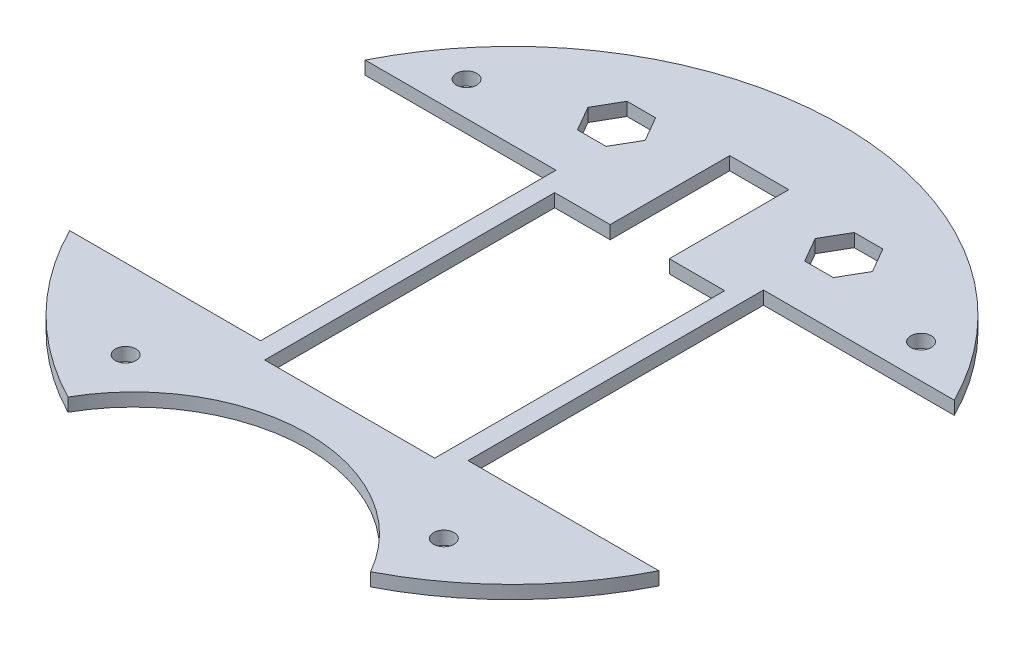
ISO-10303-21;
HEADER;
FILE_DESCRIPTION(('STEP AP214'),'2;1');
FILE_NAME('part.step','',(''),(''),'','','');
FILE_SCHEMA(('AUTOMOTIVE_DESIGN { 1 0 10303 214 1 1 1 1 }'));
ENDSEC;
DATA;
#1=APPLICATION_CONTEXT('core data for automotive mechanical design processes');
#2=APPLICATION_PROTOCOL_DEFINITION('international standard','automotive_design',2000,#1);
#3=PRODUCT_CONTEXT('',#1,'mechanical');
#4=PRODUCT('Part','Part','',(#3));
#5=PRODUCT_RELATED_PRODUCT_CATEGORY('part','',(#4));
#6=PRODUCT_DEFINITION_FORMATION('','',#4);
#7=PRODUCT_DEFINITION_CONTEXT('part definition',#1,'design');
#8=PRODUCT_DEFINITION('design','',#6,#7);
#9=PRODUCT_DEFINITION_SHAPE('','',#8);
#10=(LENGTH_UNIT() NAMED_UNIT(*) SI_UNIT(.MILLI.,.METRE.));
#11=(NAMED_UNIT(*) PLANE_ANGLE_UNIT() SI_UNIT($,.RADIAN.));
#12=(NAMED_UNIT(*) SI_UNIT($,.STERADIAN.) SOLID_ANGLE_UNIT());
#13=UNCERTAINTY_MEASURE_WITH_UNIT(LENGTH_MEASURE(1.E-05),#10,'distance_accuracy_value','');
#14=(GEOMETRIC_REPRESENTATION_CONTEXT(3) GLOBAL_UNCERTAINTY_ASSIGNED_CONTEXT((#13)) GLOBAL_UNIT_ASSIGNED_CONTEXT((#10,
#11,#12)) REPRESENTATION_CONTEXT('',''));
#15=CARTESIAN_POINT('',(0.,0.,0.));
#16=DIRECTION('',(0.,0.,1.));
#17=DIRECTION('',(1.,0.,0.));
#18=AXIS2_PLACEMENT_3D('',#15,#16,#17);
#19=CARTESIAN_POINT('',(18.7,0.,-28.1));
#20=DIRECTION('',(0.,0.,-1.));
#21=DIRECTION('',(-1.,0.,0.));
#22=AXIS2_PLACEMENT_3D('',#19,#20,#21);
#23=PLANE('',#22);
#24=DIRECTION('',(-1.,0.,0.));
#25=VECTOR('',#24,1.);
#26=CARTESIAN_POINT('',(18.7,0.,-28.1));
#27=LINE('',#26,#25);
#28=CARTESIAN_POINT('',(-6.5,0.,-28.1));
#29=VERTEX_POINT('',#28);
#30=CARTESIAN_POINT('',(-18.7,0.,-28.1));
#31=VERTEX_POINT('',#30);
#32=EDGE_CURVE('E424',#29,#31,#27,.T.);
#33=ORIENTED_EDGE('',*,*,#32,.F.);
#34=DIRECTION('',(0.,1.,0.));
#35=VECTOR('',#34,1.);
#36=CARTESIAN_POINT('',(-6.5,0.,-28.1));
#37=LINE('',#36,#35);
#38=CARTESIAN_POINT('',(-6.5,2.9,-28.1));
#39=VERTEX_POINT('',#38);
#40=EDGE_CURVE('E345',#29,#39,#37,.T.);
#41=ORIENTED_EDGE('',*,*,#40,.T.);
#42=DIRECTION('',(-1.,0.,0.));
#43=VECTOR('',#42,1.);
#44=CARTESIAN_POINT('',(18.7,2.9,-28.1));
#45=LINE('',#44,#43);
#46=CARTESIAN_POINT('',(-18.7,2.9,-28.1));
#47=VERTEX_POINT('',#46);
#48=EDGE_CURVE('E436',#39,#47,#45,.T.);
#49=ORIENTED_EDGE('',*,*,#48,.T.);
#50=DIRECTION('',(0.,1.,0.));
#51=VECTOR('',#50,1.);
#52=CARTESIAN_POINT('',(-18.7,0.,-28.1));
#53=LINE('',#52,#51);
#54=EDGE_CURVE('E439',#31,#47,#53,.T.);
#55=ORIENTED_EDGE('',*,*,#54,.F.);
#56=EDGE_LOOP('',(#33,#41,#49,#55));
#57=FACE_BOUND('',#56,.T.);
#58=ADVANCED_FACE('F33',(#57),#23,.F.);
#59=CARTESIAN_POINT('',(0.,2.9,0.));
#60=DIRECTION('',(0.,-1.,0.));
#61=DIRECTION('',(0.,0.,-1.));
#62=AXIS2_PLACEMENT_3D('',#59,#60,#61);
#63=CYLINDRICAL_SURFACE('',#62,72.5);
#64=CARTESIAN_POINT('',(0.,0.,0.));
#65=DIRECTION('',(0.,1.,0.));
#66=DIRECTION('',(0.,0.,1.));
#67=AXIS2_PLACEMENT_3D('',#64,#65,#66);
#68=CIRCLE('',#67,72.5);
#69=CARTESIAN_POINT('',(33.2911053697012,0.,64.4045984636458));
#70=VERTEX_POINT('',#69);
#71=CARTESIAN_POINT('',(64.8074069840786,0.,32.4999999999999));
#72=VERTEX_POINT('',#71);
#73=EDGE_CURVE('E453',#70,#72,#68,.T.);
#74=ORIENTED_EDGE('',*,*,#73,.T.);
#75=DIRECTION('',(0.,1.,0.));
#76=VECTOR('',#75,1.);
#77=CARTESIAN_POINT('',(64.8074069840786,0.,32.4999999999999));
#78=LINE('',#77,#76);
#79=CARTESIAN_POINT('',(64.8074069840786,2.9,32.4999999999999));
#80=VERTEX_POINT('',#79);
#81=EDGE_CURVE('E378',#72,#80,#78,.T.);
#82=ORIENTED_EDGE('',*,*,#81,.T.);
#83=CARTESIAN_POINT('',(0.,2.9,0.));
#84=DIRECTION('',(0.,1.,0.));
#85=DIRECTION('',(0.,0.,1.));
#86=AXIS2_PLACEMENT_3D('',#83,#84,#85);
#87=CIRCLE('',#86,72.5);
#88=CARTESIAN_POINT('',(33.2911053697012,2.9,64.4045984636458));
#89=VERTEX_POINT('',#88);
#90=EDGE_CURVE('E454',#89,#80,#87,.T.);
#91=ORIENTED_EDGE('',*,*,#90,.F.);
#92=DIRECTION('',(0.,-1.,0.));
#93=VECTOR('',#92,1.);
#94=CARTESIAN_POINT('',(33.2911053697012,2.9,64.4045984636458));
#95=LINE('',#94,#93);
#96=EDGE_CURVE('E11',#89,#70,#95,.T.);
#97=ORIENTED_EDGE('',*,*,#96,.T.);
#98=EDGE_LOOP('',(#74,#82,#91,#97));
#99=FACE_BOUND('',#98,.T.);
#100=ADVANCED_FACE('F475',(#99),#63,.T.);
#101=CARTESIAN_POINT('',(64.8074069840786,2.9,-32.5));
#102=VERTEX_POINT('',#101);
#103=CARTESIAN_POINT('',(-64.8074069840786,2.9,-32.5));
#104=VERTEX_POINT('',#103);
#105=EDGE_CURVE('E457',#102,#104,#87,.T.);
#106=ORIENTED_EDGE('',*,*,#105,.F.);
#107=DIRECTION('',(0.,1.,0.));
#108=VECTOR('',#107,1.);
#109=CARTESIAN_POINT('',(64.8074069840786,0.,-32.5));
#110=LINE('',#109,#108);
#111=CARTESIAN_POINT('',(64.8074069840786,0.,-32.5));
#112=VERTEX_POINT('',#111);
#113=EDGE_CURVE('E371',#112,#102,#110,.T.);
#114=ORIENTED_EDGE('',*,*,#113,.F.);
#115=CARTESIAN_POINT('',(-64.8074069840786,0.,-32.5));
#116=VERTEX_POINT('',#115);
#117=EDGE_CURVE('E462',#112,#116,#68,.T.);
#118=ORIENTED_EDGE('',*,*,#117,.T.);
#119=DIRECTION('',(0.,1.,0.));
#120=VECTOR('',#119,1.);
#121=CARTESIAN_POINT('',(-64.8074069840786,0.,-32.5));
#122=LINE('',#121,#120);
#123=EDGE_CURVE('E408',#116,#104,#122,.T.);
#124=ORIENTED_EDGE('',*,*,#123,.T.);
#125=EDGE_LOOP('',(#106,#114,#118,#124));
#126=FACE_BOUND('',#125,.T.);
#127=ADVANCED_FACE('F492',(#126),#63,.T.);
#128=CARTESIAN_POINT('',(0.,2.9,83.2397996376034));
#129=DIRECTION('',(0.,-1.,0.));
#130=DIRECTION('',(0.,0.,-1.));
#131=AXIS2_PLACEMENT_3D('',#128,#129,#130);
#132=CYLINDRICAL_SURFACE('',#131,38.25);
#133=CARTESIAN_POINT('',(0.,0.,83.2397996376034));
#134=DIRECTION('',(0.,-1.,0.));
#135=DIRECTION('',(0.,0.,1.));
#136=AXIS2_PLACEMENT_3D('',#133,#134,#135);
#137=CIRCLE('',#136,38.25);
#138=CARTESIAN_POINT('',(-33.2911053697012,0.,64.4045984636458));
#139=VERTEX_POINT('',#138);
#140=EDGE_CURVE('E442',#139,#70,#137,.T.);
#141=ORIENTED_EDGE('',*,*,#140,.T.);
#142=ORIENTED_EDGE('',*,*,#96,.F.);
#143=CARTESIAN_POINT('',(0.,2.9,83.2397996376034));
#144=DIRECTION('',(0.,-1.,0.));
#145=DIRECTION('',(0.,0.,1.));
#146=AXIS2_PLACEMENT_3D('',#143,#144,#145);
#147=CIRCLE('',#146,38.25);
#148=CARTESIAN_POINT('',(-33.2911053697012,2.9,64.4045984636458));
#149=VERTEX_POINT('',#148);
#150=EDGE_CURVE('E449',#149,#89,#147,.T.);
#151=ORIENTED_EDGE('',*,*,#150,.F.);
#152=DIRECTION('',(0.,-1.,0.));
#153=VECTOR('',#152,1.);
#154=CARTESIAN_POINT('',(-33.2911053697012,2.9,64.4045984636458));
#155=LINE('',#154,#153);
#156=EDGE_CURVE('E41',#149,#139,#155,.T.);
#157=ORIENTED_EDGE('',*,*,#156,.T.);
#158=EDGE_LOOP('',(#141,#142,#151,#157));
#159=FACE_BOUND('',#158,.T.);
#160=ADVANCED_FACE('F35',(#159),#132,.F.);
#161=CARTESIAN_POINT('',(-64.8074069840787,2.9,32.4999999999999));
#162=VERTEX_POINT('',#161);
#163=EDGE_CURVE('E452',#162,#149,#87,.T.);
#164=ORIENTED_EDGE('',*,*,#163,.F.);
#165=DIRECTION('',(0.,1.,0.));
#166=VECTOR('',#165,1.);
#167=CARTESIAN_POINT('',(-64.8074069840787,0.,32.4999999999999));
#168=LINE('',#167,#166);
#169=CARTESIAN_POINT('',(-64.8074069840787,0.,32.4999999999999));
#170=VERTEX_POINT('',#169);
#171=EDGE_CURVE('E405',#170,#162,#168,.T.);
#172=ORIENTED_EDGE('',*,*,#171,.F.);
#173=EDGE_CURVE('E460',#170,#139,#68,.T.);
#174=ORIENTED_EDGE('',*,*,#173,.T.);
#175=ORIENTED_EDGE('',*,*,#156,.F.);
#176=EDGE_LOOP('',(#164,#172,#174,#175));
#177=FACE_BOUND('',#176,.T.);
#178=ADVANCED_FACE('F494',(#177),#63,.T.);
#179=CARTESIAN_POINT('',(0.,2.9,41.6198998188017));
#180=DIRECTION('',(0.,1.,0.));
#181=DIRECTION('',(0.,0.,1.));
#182=AXIS2_PLACEMENT_3D('',#179,#180,#181);
#183=PLANE('',#182);
#184=CARTESIAN_POINT('',(-35.,2.9,50.));
#185=DIRECTION('',(0.,1.,0.));
#186=DIRECTION('',(0.,0.,1.));
#187=AXIS2_PLACEMENT_3D('',#184,#185,#186);
#188=CIRCLE('',#187,2.25);
#189=CARTESIAN_POINT('',(-35.,2.9,52.25));
#190=VERTEX_POINT('',#189);
#191=EDGE_CURVE('E782',#190,#190,#188,.T.);
#192=ORIENTED_EDGE('',*,*,#191,.F.);
#193=EDGE_LOOP('',(#192));
#194=FACE_BOUND('',#193,.T.);
#195=CARTESIAN_POINT('',(-50.,2.9,-40.));
#196=DIRECTION('',(0.,1.,0.));
#197=DIRECTION('',(0.,0.,1.));
#198=AXIS2_PLACEMENT_3D('',#195,#196,#197);
#199=CIRCLE('',#198,2.25);
#200=CARTESIAN_POINT('',(-50.,2.9,-37.75));
#201=VERTEX_POINT('',#200);
#202=EDGE_CURVE('E787',#201,#201,#199,.T.);
#203=ORIENTED_EDGE('',*,*,#202,.F.);
#204=EDGE_LOOP('',(#203));
#205=FACE_BOUND('',#204,.T.);
#206=CARTESIAN_POINT('',(50.,2.9,-40.));
#207=DIRECTION('',(0.,1.,0.));
#208=DIRECTION('',(0.,0.,1.));
#209=AXIS2_PLACEMENT_3D('',#206,#207,#208);
#210=CIRCLE('',#209,2.25);
#211=CARTESIAN_POINT('',(50.,2.9,-37.75));
#212=VERTEX_POINT('',#211);
#213=EDGE_CURVE('E795',#212,#212,#210,.T.);
#214=ORIENTED_EDGE('',*,*,#213,.F.);
#215=EDGE_LOOP('',(#214));
#216=FACE_BOUND('',#215,.T.);
#217=CARTESIAN_POINT('',(35.,2.9,50.));
#218=DIRECTION('',(0.,1.,0.));
#219=DIRECTION('',(0.,0.,1.));
#220=AXIS2_PLACEMENT_3D('',#217,#218,#219);
#221=CIRCLE('',#220,2.25);
#222=CARTESIAN_POINT('',(35.,2.9,52.25));
#223=VERTEX_POINT('',#222);
#224=EDGE_CURVE('E255',#223,#223,#221,.T.);
#225=ORIENTED_EDGE('',*,*,#224,.F.);
#226=EDGE_LOOP('',(#225));
#227=FACE_BOUND('',#226,.T.);
#228=DIRECTION('',(1.,0.,0.));
#229=VECTOR('',#228,1.);
#230=CARTESIAN_POINT('',(28.1465589670835,2.9,-42.55));
#231=LINE('',#230,#229);
#232=CARTESIAN_POINT('',(21.8534410329166,2.9,-42.55));
#233=VERTEX_POINT('',#232);
#234=CARTESIAN_POINT('',(28.1465589670834,2.9,-42.55));
#235=VERTEX_POINT('',#234);
#236=EDGE_CURVE('E48',#233,#235,#231,.T.);
#237=ORIENTED_EDGE('',*,*,#236,.F.);
#238=DIRECTION('',(0.5,0.,0.866025403784439));
#239=VECTOR('',#238,1.);
#240=CARTESIAN_POINT('',(21.8534410329166,2.9,-42.55));
#241=LINE('',#240,#239);
#242=CARTESIAN_POINT('',(18.7068820658331,2.9,-48.));
#243=VERTEX_POINT('',#242);
#244=EDGE_CURVE('E249',#243,#233,#241,.T.);
#245=ORIENTED_EDGE('',*,*,#244,.F.);
#246=DIRECTION('',(-0.5,0.,0.866025403784438));
#247=VECTOR('',#246,1.);
#248=CARTESIAN_POINT('',(18.7068820658331,2.9,-48.));
#249=LINE('',#248,#247);
#250=CARTESIAN_POINT('',(21.8534410329165,2.9,-53.45));
#251=VERTEX_POINT('',#250);
#252=EDGE_CURVE('E252',#251,#243,#249,.T.);
#253=ORIENTED_EDGE('',*,*,#252,.F.);
#254=DIRECTION('',(-1.,0.,0.));
#255=VECTOR('',#254,1.);
#256=CARTESIAN_POINT('',(21.8534410329165,2.9,-53.45));
#257=LINE('',#256,#255);
#258=CARTESIAN_POINT('',(28.1465589670835,2.9,-53.45));
#259=VERTEX_POINT('',#258);
#260=EDGE_CURVE('E272',#259,#251,#257,.T.);
#261=ORIENTED_EDGE('',*,*,#260,.F.);
#262=DIRECTION('',(-0.5,0.,-0.866025403784439));
#263=VECTOR('',#262,1.);
#264=CARTESIAN_POINT('',(28.1465589670835,2.9,-53.45));
#265=LINE('',#264,#263);
#266=CARTESIAN_POINT('',(31.2931179341669,2.9,-48.));
#267=VERTEX_POINT('',#266);
#268=EDGE_CURVE('E269',#267,#259,#265,.T.);
#269=ORIENTED_EDGE('',*,*,#268,.F.);
#270=DIRECTION('',(0.499999999999999,0.,-0.866025403784439));
#271=VECTOR('',#270,1.);
#272=CARTESIAN_POINT('',(31.2931179341669,2.9,-48.));
#273=LINE('',#272,#271);
#274=EDGE_CURVE('E266',#235,#267,#273,.T.);
#275=ORIENTED_EDGE('',*,*,#274,.F.);
#276=EDGE_LOOP('',(#237,#245,#253,#261,#269,#275));
#277=FACE_BOUND('',#276,.T.);
#278=DIRECTION('',(0.5,0.,-0.866025403784439));
#279=VECTOR('',#278,1.);
#280=CARTESIAN_POINT('',(-21.8534410329166,2.9,-42.55));
#281=LINE('',#280,#279);
#282=CARTESIAN_POINT('',(-21.8534410329166,2.9,-42.55));
#283=VERTEX_POINT('',#282);
#284=CARTESIAN_POINT('',(-18.7068820658331,2.9,-48.));
#285=VERTEX_POINT('',#284);
#286=EDGE_CURVE('E279',#283,#285,#281,.T.);
#287=ORIENTED_EDGE('',*,*,#286,.F.);
#288=DIRECTION('',(1.,0.,0.));
#289=VECTOR('',#288,1.);
#290=CARTESIAN_POINT('',(-28.1465589670835,2.9,-42.55));
#291=LINE('',#290,#289);
#292=CARTESIAN_POINT('',(-28.1465589670835,2.9,-42.55));
#293=VERTEX_POINT('',#292);
#294=EDGE_CURVE('E291',#293,#283,#291,.T.);
#295=ORIENTED_EDGE('',*,*,#294,.F.);
#296=DIRECTION('',(0.499999999999999,0.,0.866025403784439));
#297=VECTOR('',#296,1.);
#298=CARTESIAN_POINT('',(-31.2931179341669,2.9,-48.));
#299=LINE('',#298,#297);
#300=CARTESIAN_POINT('',(-31.2931179341669,2.9,-48.));
#301=VERTEX_POINT('',#300);
#302=EDGE_CURVE('E317',#301,#293,#299,.T.);
#303=ORIENTED_EDGE('',*,*,#302,.F.);
#304=DIRECTION('',(-0.5,0.,0.866025403784439));
#305=VECTOR('',#304,1.);
#306=CARTESIAN_POINT('',(-28.1465589670835,2.9,-53.45));
#307=LINE('',#306,#305);
#308=CARTESIAN_POINT('',(-28.1465589670835,2.9,-53.45));
#309=VERTEX_POINT('',#308);
#310=EDGE_CURVE('E314',#309,#301,#307,.T.);
#311=ORIENTED_EDGE('',*,*,#310,.F.);
#312=DIRECTION('',(-1.,0.,0.));
#313=VECTOR('',#312,1.);
#314=CARTESIAN_POINT('',(-21.8534410329165,2.9,-53.45));
#315=LINE('',#314,#313);
#316=CARTESIAN_POINT('',(-21.8534410329165,2.9,-53.45));
#317=VERTEX_POINT('',#316);
#318=EDGE_CURVE('E311',#317,#309,#315,.T.);
#319=ORIENTED_EDGE('',*,*,#318,.F.);
#320=DIRECTION('',(-0.5,0.,-0.866025403784438));
#321=VECTOR('',#320,1.);
#322=CARTESIAN_POINT('',(-18.7068820658331,2.9,-48.));
#323=LINE('',#322,#321);
#324=EDGE_CURVE('E308',#285,#317,#323,.T.);
#325=ORIENTED_EDGE('',*,*,#324,.F.);
#326=EDGE_LOOP('',(#287,#295,#303,#311,#319,#325));
#327=FACE_BOUND('',#326,.T.);
#328=DIRECTION('',(0.,0.,1.));
#329=VECTOR('',#328,1.);
#330=CARTESIAN_POINT('',(-6.5,2.9,-28.1));
#331=LINE('',#330,#329);
#332=CARTESIAN_POINT('',(-6.5,2.9,-54.4));
#333=VERTEX_POINT('',#332);
#334=EDGE_CURVE('E324',#333,#39,#331,.T.);
#335=ORIENTED_EDGE('',*,*,#334,.F.);
#336=DIRECTION('',(-1.,0.,0.));
#337=VECTOR('',#336,1.);
#338=CARTESIAN_POINT('',(6.5,2.9,-54.4));
#339=LINE('',#338,#337);
#340=CARTESIAN_POINT('',(6.5,2.9,-54.4));
#341=VERTEX_POINT('',#340);
#342=EDGE_CURVE('E339',#341,#333,#339,.T.);
#343=ORIENTED_EDGE('',*,*,#342,.F.);
#344=DIRECTION('',(0.,0.,-1.));
#345=VECTOR('',#344,1.);
#346=CARTESIAN_POINT('',(6.5,2.9,-28.1));
#347=LINE('',#346,#345);
#348=CARTESIAN_POINT('',(6.5,2.9,-28.1));
#349=VERTEX_POINT('',#348);
#350=EDGE_CURVE('E347',#349,#341,#347,.T.);
#351=ORIENTED_EDGE('',*,*,#350,.F.);
#352=CARTESIAN_POINT('',(18.7,2.9,-28.1));
#353=VERTEX_POINT('',#352);
#354=EDGE_CURVE('E418',#353,#349,#45,.T.);
#355=ORIENTED_EDGE('',*,*,#354,.F.);
#356=DIRECTION('',(0.,0.,-1.));
#357=VECTOR('',#356,1.);
#358=CARTESIAN_POINT('',(18.7,2.9,35.7));
#359=LINE('',#358,#357);
#360=CARTESIAN_POINT('',(18.7,2.9,35.7));
#361=VERTEX_POINT('',#360);
#362=EDGE_CURVE('E433',#361,#353,#359,.T.);
#363=ORIENTED_EDGE('',*,*,#362,.F.);
#364=DIRECTION('',(1.,0.,0.));
#365=VECTOR('',#364,1.);
#366=CARTESIAN_POINT('',(-18.7,2.9,35.7));
#367=LINE('',#366,#365);
#368=CARTESIAN_POINT('',(-18.7,2.9,35.7));
#369=VERTEX_POINT('',#368);
#370=EDGE_CURVE('E430',#369,#361,#367,.T.);
#371=ORIENTED_EDGE('',*,*,#370,.F.);
#372=DIRECTION('',(0.,0.,1.));
#373=VECTOR('',#372,1.);
#374=CARTESIAN_POINT('',(-18.7,2.9,-28.1));
#375=LINE('',#374,#373);
#376=EDGE_CURVE('E407',#47,#369,#375,.T.);
#377=ORIENTED_EDGE('',*,*,#376,.F.);
#378=ORIENTED_EDGE('',*,*,#48,.F.);
#379=EDGE_LOOP('',(#335,#343,#351,#355,#363,#371,#377,#378));
#380=FACE_BOUND('',#379,.T.);
#381=DIRECTION('',(1.,0.,0.));
#382=VECTOR('',#381,1.);
#383=CARTESIAN_POINT('',(34.6299999999999,2.9,32.5));
#384=LINE('',#383,#382);
#385=CARTESIAN_POINT('',(22.8299999999999,2.9,32.4999999999999));
#386=VERTEX_POINT('',#385);
#387=EDGE_CURVE('E365',#386,#80,#384,.T.);
#388=ORIENTED_EDGE('',*,*,#387,.F.);
#389=DIRECTION('',(0.,0.,1.));
#390=VECTOR('',#389,1.);
#391=CARTESIAN_POINT('',(22.8299999999999,2.9,-32.5));
#392=LINE('',#391,#390);
#393=CARTESIAN_POINT('',(22.8299999999999,2.9,-32.5));
#394=VERTEX_POINT('',#393);
#395=EDGE_CURVE('E374',#394,#386,#392,.T.);
#396=ORIENTED_EDGE('',*,*,#395,.F.);
#397=DIRECTION('',(-1.,0.,0.));
#398=VECTOR('',#397,1.);
#399=CARTESIAN_POINT('',(64.8074069840786,2.9,-32.5));
#400=LINE('',#399,#398);
#401=EDGE_CURVE('E354',#102,#394,#400,.T.);
#402=ORIENTED_EDGE('',*,*,#401,.F.);
#403=ORIENTED_EDGE('',*,*,#105,.T.);
#404=DIRECTION('',(-1.,0.,0.));
#405=VECTOR('',#404,1.);
#406=CARTESIAN_POINT('',(-22.8299999999999,2.9,-32.5));
#407=LINE('',#406,#405);
#408=CARTESIAN_POINT('',(-22.8299999999999,2.9,-32.5));
#409=VERTEX_POINT('',#408);
#410=EDGE_CURVE('E391',#409,#104,#407,.T.);
#411=ORIENTED_EDGE('',*,*,#410,.F.);
#412=DIRECTION('',(0.,0.,-1.));
#413=VECTOR('',#412,1.);
#414=CARTESIAN_POINT('',(-22.8299999999999,2.9,32.4999999999999));
#415=LINE('',#414,#413);
#416=CARTESIAN_POINT('',(-22.8299999999999,2.9,32.4999999999999));
#417=VERTEX_POINT('',#416);
#418=EDGE_CURVE('E400',#417,#409,#415,.T.);
#419=ORIENTED_EDGE('',*,*,#418,.F.);
#420=DIRECTION('',(1.,0.,0.));
#421=VECTOR('',#420,1.);
#422=CARTESIAN_POINT('',(-34.6299999999999,2.9,32.5));
#423=LINE('',#422,#421);
#424=EDGE_CURVE('E381',#162,#417,#423,.T.);
#425=ORIENTED_EDGE('',*,*,#424,.F.);
#426=ORIENTED_EDGE('',*,*,#163,.T.);
#427=ORIENTED_EDGE('',*,*,#150,.T.);
#428=ORIENTED_EDGE('',*,*,#90,.T.);
#429=EDGE_LOOP('',(#388,#396,#402,#403,#411,#419,#425,#426,#427,#428));
#430=FACE_BOUND('',#429,.T.);
#431=ADVANCED_FACE('F478',(#194,#205,#216,#227,#277,#327,#380,#430),#183,.T.);
#432=CARTESIAN_POINT('',(0.,0.,41.6198998188017));
#433=DIRECTION('',(0.,1.,0.));
#434=DIRECTION('',(0.,0.,1.));
#435=AXIS2_PLACEMENT_3D('',#432,#433,#434);
#436=PLANE('',#435);
#437=CARTESIAN_POINT('',(-35.,0.,50.));
#438=DIRECTION('',(0.,1.,0.));
#439=DIRECTION('',(0.,0.,1.));
#440=AXIS2_PLACEMENT_3D('',#437,#438,#439);
#441=CIRCLE('',#440,2.25);
#442=CARTESIAN_POINT('',(-35.,0.,52.25));
#443=VERTEX_POINT('',#442);
#444=EDGE_CURVE('E779',#443,#443,#441,.T.);
#445=ORIENTED_EDGE('',*,*,#444,.T.);
#446=EDGE_LOOP('',(#445));
#447=FACE_BOUND('',#446,.T.);
#448=CARTESIAN_POINT('',(-50.,0.,-40.));
#449=DIRECTION('',(0.,1.,0.));
#450=DIRECTION('',(0.,0.,1.));
#451=AXIS2_PLACEMENT_3D('',#448,#449,#450);
#452=CIRCLE('',#451,2.25);
#453=CARTESIAN_POINT('',(-50.,0.,-37.75));
#454=VERTEX_POINT('',#453);
#455=EDGE_CURVE('E783',#454,#454,#452,.T.);
#456=ORIENTED_EDGE('',*,*,#455,.T.);
#457=EDGE_LOOP('',(#456));
#458=FACE_BOUND('',#457,.T.);
#459=CARTESIAN_POINT('',(50.,0.,-40.));
#460=DIRECTION('',(0.,1.,0.));
#461=DIRECTION('',(0.,0.,1.));
#462=AXIS2_PLACEMENT_3D('',#459,#460,#461);
#463=CIRCLE('',#462,2.25);
#464=CARTESIAN_POINT('',(50.,0.,-37.75));
#465=VERTEX_POINT('',#464);
#466=EDGE_CURVE('E792',#465,#465,#463,.T.);
#467=ORIENTED_EDGE('',*,*,#466,.T.);
#468=EDGE_LOOP('',(#467));
#469=FACE_BOUND('',#468,.T.);
#470=CARTESIAN_POINT('',(35.,0.,50.));
#471=DIRECTION('',(0.,1.,0.));
#472=DIRECTION('',(0.,0.,1.));
#473=AXIS2_PLACEMENT_3D('',#470,#471,#472);
#474=CIRCLE('',#473,2.25);
#475=CARTESIAN_POINT('',(35.,0.,52.25));
#476=VERTEX_POINT('',#475);
#477=EDGE_CURVE('E267',#476,#476,#474,.T.);
#478=ORIENTED_EDGE('',*,*,#477,.T.);
#479=EDGE_LOOP('',(#478));
#480=FACE_BOUND('',#479,.T.);
#481=DIRECTION('',(0.5,0.,0.866025403784439));
#482=VECTOR('',#481,1.);
#483=CARTESIAN_POINT('',(21.8534410329166,0.,-42.55));
#484=LINE('',#483,#482);
#485=CARTESIAN_POINT('',(18.7068820658331,0.,-48.));
#486=VERTEX_POINT('',#485);
#487=CARTESIAN_POINT('',(21.8534410329166,0.,-42.55));
#488=VERTEX_POINT('',#487);
#489=EDGE_CURVE('E238',#486,#488,#484,.T.);
#490=ORIENTED_EDGE('',*,*,#489,.T.);
#491=DIRECTION('',(1.,0.,0.));
#492=VECTOR('',#491,1.);
#493=CARTESIAN_POINT('',(28.1465589670835,0.,-42.55));
#494=LINE('',#493,#492);
#495=CARTESIAN_POINT('',(28.1465589670835,0.,-42.55));
#496=VERTEX_POINT('',#495);
#497=EDGE_CURVE('E232',#488,#496,#494,.T.);
#498=ORIENTED_EDGE('',*,*,#497,.T.);
#499=DIRECTION('',(0.499999999999999,0.,-0.866025403784439));
#500=VECTOR('',#499,1.);
#501=CARTESIAN_POINT('',(31.2931179341669,0.,-48.));
#502=LINE('',#501,#500);
#503=CARTESIAN_POINT('',(31.2931179341669,0.,-48.));
#504=VERTEX_POINT('',#503);
#505=EDGE_CURVE('E241',#496,#504,#502,.T.);
#506=ORIENTED_EDGE('',*,*,#505,.T.);
#507=DIRECTION('',(-0.5,0.,-0.866025403784439));
#508=VECTOR('',#507,1.);
#509=CARTESIAN_POINT('',(28.1465589670835,0.,-53.45));
#510=LINE('',#509,#508);
#511=CARTESIAN_POINT('',(28.1465589670835,0.,-53.45));
#512=VERTEX_POINT('',#511);
#513=EDGE_CURVE('E56',#504,#512,#510,.T.);
#514=ORIENTED_EDGE('',*,*,#513,.T.);
#515=DIRECTION('',(-1.,0.,0.));
#516=VECTOR('',#515,1.);
#517=CARTESIAN_POINT('',(21.8534410329165,0.,-53.45));
#518=LINE('',#517,#516);
#519=CARTESIAN_POINT('',(21.8534410329165,0.,-53.45));
#520=VERTEX_POINT('',#519);
#521=EDGE_CURVE('E259',#512,#520,#518,.T.);
#522=ORIENTED_EDGE('',*,*,#521,.T.);
#523=DIRECTION('',(-0.5,0.,0.866025403784438));
#524=VECTOR('',#523,1.);
#525=CARTESIAN_POINT('',(18.7068820658331,0.,-48.));
#526=LINE('',#525,#524);
#527=EDGE_CURVE('E262',#520,#486,#526,.T.);
#528=ORIENTED_EDGE('',*,*,#527,.T.);
#529=EDGE_LOOP('',(#490,#498,#506,#514,#522,#528));
#530=FACE_BOUND('',#529,.T.);
#531=DIRECTION('',(1.,0.,0.));
#532=VECTOR('',#531,1.);
#533=CARTESIAN_POINT('',(-28.1465589670835,0.,-42.55));
#534=LINE('',#533,#532);
#535=CARTESIAN_POINT('',(-28.1465589670835,0.,-42.55));
#536=VERTEX_POINT('',#535);
#537=CARTESIAN_POINT('',(-21.8534410329166,0.,-42.55));
#538=VERTEX_POINT('',#537);
#539=EDGE_CURVE('E303',#536,#538,#534,.T.);
#540=ORIENTED_EDGE('',*,*,#539,.T.);
#541=DIRECTION('',(0.5,0.,-0.866025403784439));
#542=VECTOR('',#541,1.);
#543=CARTESIAN_POINT('',(-21.8534410329166,0.,-42.55));
#544=LINE('',#543,#542);
#545=CARTESIAN_POINT('',(-18.7068820658331,0.,-48.));
#546=VERTEX_POINT('',#545);
#547=EDGE_CURVE('E287',#538,#546,#544,.T.);
#548=ORIENTED_EDGE('',*,*,#547,.T.);
#549=DIRECTION('',(-0.5,0.,-0.866025403784438));
#550=VECTOR('',#549,1.);
#551=CARTESIAN_POINT('',(-18.7068820658331,0.,-48.));
#552=LINE('',#551,#550);
#553=CARTESIAN_POINT('',(-21.8534410329166,0.,-53.45));
#554=VERTEX_POINT('',#553);
#555=EDGE_CURVE('E290',#546,#554,#552,.T.);
#556=ORIENTED_EDGE('',*,*,#555,.T.);
#557=DIRECTION('',(-1.,0.,0.));
#558=VECTOR('',#557,1.);
#559=CARTESIAN_POINT('',(-21.8534410329165,0.,-53.45));
#560=LINE('',#559,#558);
#561=CARTESIAN_POINT('',(-28.1465589670835,0.,-53.45));
#562=VERTEX_POINT('',#561);
#563=EDGE_CURVE('E294',#554,#562,#560,.T.);
#564=ORIENTED_EDGE('',*,*,#563,.T.);
#565=DIRECTION('',(-0.5,0.,0.866025403784439));
#566=VECTOR('',#565,1.);
#567=CARTESIAN_POINT('',(-28.1465589670835,0.,-53.45));
#568=LINE('',#567,#566);
#569=CARTESIAN_POINT('',(-31.2931179341669,0.,-48.));
#570=VERTEX_POINT('',#569);
#571=EDGE_CURVE('E297',#562,#570,#568,.T.);
#572=ORIENTED_EDGE('',*,*,#571,.T.);
#573=DIRECTION('',(0.499999999999999,0.,0.866025403784439));
#574=VECTOR('',#573,1.);
#575=CARTESIAN_POINT('',(-31.2931179341669,0.,-48.));
#576=LINE('',#575,#574);
#577=EDGE_CURVE('E300',#570,#536,#576,.T.);
#578=ORIENTED_EDGE('',*,*,#577,.T.);
#579=EDGE_LOOP('',(#540,#548,#556,#564,#572,#578));
#580=FACE_BOUND('',#579,.T.);
#581=DIRECTION('',(-1.,0.,0.));
#582=VECTOR('',#581,1.);
#583=CARTESIAN_POINT('',(6.5,0.,-54.4));
#584=LINE('',#583,#582);
#585=CARTESIAN_POINT('',(6.5,0.,-54.4));
#586=VERTEX_POINT('',#585);
#587=CARTESIAN_POINT('',(-6.5,0.,-54.4));
#588=VERTEX_POINT('',#587);
#589=EDGE_CURVE('E342',#586,#588,#584,.T.);
#590=ORIENTED_EDGE('',*,*,#589,.T.);
#591=DIRECTION('',(0.,0.,1.));
#592=VECTOR('',#591,1.);
#593=CARTESIAN_POINT('',(-6.5,0.,-28.1));
#594=LINE('',#593,#592);
#595=EDGE_CURVE('E335',#588,#29,#594,.T.);
#596=ORIENTED_EDGE('',*,*,#595,.T.);
#597=ORIENTED_EDGE('',*,*,#32,.T.);
#598=DIRECTION('',(0.,0.,1.));
#599=VECTOR('',#598,1.);
#600=CARTESIAN_POINT('',(-18.7,0.,-28.1));
#601=LINE('',#600,#599);
#602=CARTESIAN_POINT('',(-18.7,0.,35.7));
#603=VERTEX_POINT('',#602);
#604=EDGE_CURVE('E414',#31,#603,#601,.T.);
#605=ORIENTED_EDGE('',*,*,#604,.T.);
#606=DIRECTION('',(1.,0.,0.));
#607=VECTOR('',#606,1.);
#608=CARTESIAN_POINT('',(-18.7,0.,35.7));
#609=LINE('',#608,#607);
#610=CARTESIAN_POINT('',(18.7,0.,35.7));
#611=VERTEX_POINT('',#610);
#612=EDGE_CURVE('E417',#603,#611,#609,.T.);
#613=ORIENTED_EDGE('',*,*,#612,.T.);
#614=DIRECTION('',(0.,0.,-1.));
#615=VECTOR('',#614,1.);
#616=CARTESIAN_POINT('',(18.7,0.,35.7));
#617=LINE('',#616,#615);
#618=CARTESIAN_POINT('',(18.7,0.,-28.1));
#619=VERTEX_POINT('',#618);
#620=EDGE_CURVE('E421',#611,#619,#617,.T.);
#621=ORIENTED_EDGE('',*,*,#620,.T.);
#622=CARTESIAN_POINT('',(6.5,0.,-28.1));
#623=VERTEX_POINT('',#622);
#624=EDGE_CURVE('E425',#619,#623,#27,.T.);
#625=ORIENTED_EDGE('',*,*,#624,.T.);
#626=DIRECTION('',(0.,0.,-1.));
#627=VECTOR('',#626,1.);
#628=CARTESIAN_POINT('',(6.5,0.,-28.1));
#629=LINE('',#628,#627);
#630=EDGE_CURVE('E338',#623,#586,#629,.T.);
#631=ORIENTED_EDGE('',*,*,#630,.T.);
#632=EDGE_LOOP('',(#590,#596,#597,#605,#613,#621,#625,#631));
#633=FACE_BOUND('',#632,.T.);
#634=DIRECTION('',(0.,0.,1.));
#635=VECTOR('',#634,1.);
#636=CARTESIAN_POINT('',(22.8299999999999,0.,-32.5));
#637=LINE('',#636,#635);
#638=CARTESIAN_POINT('',(22.8299999999999,0.,-32.5));
#639=VERTEX_POINT('',#638);
#640=CARTESIAN_POINT('',(22.8299999999999,0.,32.4999999999999));
#641=VERTEX_POINT('',#640);
#642=EDGE_CURVE('E364',#639,#641,#637,.T.);
#643=ORIENTED_EDGE('',*,*,#642,.T.);
#644=DIRECTION('',(1.,0.,0.));
#645=VECTOR('',#644,1.);
#646=CARTESIAN_POINT('',(22.8299999999999,0.,32.4999999999999));
#647=LINE('',#646,#645);
#648=EDGE_CURVE('E368',#641,#72,#647,.T.);
#649=ORIENTED_EDGE('',*,*,#648,.T.);
#650=ORIENTED_EDGE('',*,*,#73,.F.);
#651=ORIENTED_EDGE('',*,*,#140,.F.);
#652=ORIENTED_EDGE('',*,*,#173,.F.);
#653=DIRECTION('',(1.,0.,0.));
#654=VECTOR('',#653,1.);
#655=CARTESIAN_POINT('',(-64.8074069840786,0.,32.4999999999999));
#656=LINE('',#655,#654);
#657=CARTESIAN_POINT('',(-22.8299999999999,0.,32.4999999999999));
#658=VERTEX_POINT('',#657);
#659=EDGE_CURVE('E387',#170,#658,#656,.T.);
#660=ORIENTED_EDGE('',*,*,#659,.T.);
#661=DIRECTION('',(0.,0.,-1.));
#662=VECTOR('',#661,1.);
#663=CARTESIAN_POINT('',(-22.8299999999999,0.,32.4999999999999));
#664=LINE('',#663,#662);
#665=CARTESIAN_POINT('',(-22.8299999999999,0.,-32.5));
#666=VERTEX_POINT('',#665);
#667=EDGE_CURVE('E390',#658,#666,#664,.T.);
#668=ORIENTED_EDGE('',*,*,#667,.T.);
#669=DIRECTION('',(-1.,0.,0.));
#670=VECTOR('',#669,1.);
#671=CARTESIAN_POINT('',(-22.8299999999999,0.,-32.5));
#672=LINE('',#671,#670);
#673=EDGE_CURVE('E394',#666,#116,#672,.T.);
#674=ORIENTED_EDGE('',*,*,#673,.T.);
#675=ORIENTED_EDGE('',*,*,#117,.F.);
#676=DIRECTION('',(-1.,0.,0.));
#677=VECTOR('',#676,1.);
#678=CARTESIAN_POINT('',(64.8074069840786,0.,-32.5));
#679=LINE('',#678,#677);
#680=EDGE_CURVE('E361',#112,#639,#679,.T.);
#681=ORIENTED_EDGE('',*,*,#680,.T.);
#682=EDGE_LOOP('',(#643,#649,#650,#651,#652,#660,#668,#674,#675,#681));
#683=FACE_BOUND('',#682,.T.);
#684=ADVANCED_FACE('F245',(#447,#458,#469,#480,#530,#580,#633,#683),#436,.F.);
#685=CARTESIAN_POINT('',(-18.7,0.,-28.1));
#686=DIRECTION('',(-1.,0.,0.));
#687=DIRECTION('',(0.,0.,1.));
#688=AXIS2_PLACEMENT_3D('',#685,#686,#687);
#689=PLANE('',#688);
#690=ORIENTED_EDGE('',*,*,#376,.T.);
#691=DIRECTION('',(0.,1.,0.));
#692=VECTOR('',#691,1.);
#693=CARTESIAN_POINT('',(-18.7,0.,35.7));
#694=LINE('',#693,#692);
#695=EDGE_CURVE('E428',#603,#369,#694,.T.);
#696=ORIENTED_EDGE('',*,*,#695,.F.);
#697=ORIENTED_EDGE('',*,*,#604,.F.);
#698=ORIENTED_EDGE('',*,*,#54,.T.);
#699=EDGE_LOOP('',(#690,#696,#697,#698));
#700=FACE_BOUND('',#699,.T.);
#701=ADVANCED_FACE('F521',(#700),#689,.F.);
#702=ORIENTED_EDGE('',*,*,#354,.T.);
#703=DIRECTION('',(0.,1.,0.));
#704=VECTOR('',#703,1.);
#705=CARTESIAN_POINT('',(6.5,0.,-28.1));
#706=LINE('',#705,#704);
#707=EDGE_CURVE('E357',#623,#349,#706,.T.);
#708=ORIENTED_EDGE('',*,*,#707,.F.);
#709=ORIENTED_EDGE('',*,*,#624,.F.);
#710=DIRECTION('',(0.,1.,0.));
#711=VECTOR('',#710,1.);
#712=CARTESIAN_POINT('',(18.7,0.,-28.1));
#713=LINE('',#712,#711);
#714=EDGE_CURVE('E443',#619,#353,#713,.T.);
#715=ORIENTED_EDGE('',*,*,#714,.T.);
#716=EDGE_LOOP('',(#702,#708,#709,#715));
#717=FACE_BOUND('',#716,.T.);
#718=ADVANCED_FACE('F513',(#717),#23,.F.);
#719=CARTESIAN_POINT('',(18.7,0.,35.7));
#720=DIRECTION('',(1.,0.,0.));
#721=DIRECTION('',(0.,0.,-1.));
#722=AXIS2_PLACEMENT_3D('',#719,#720,#721);
#723=PLANE('',#722);
#724=ORIENTED_EDGE('',*,*,#362,.T.);
#725=ORIENTED_EDGE('',*,*,#714,.F.);
#726=ORIENTED_EDGE('',*,*,#620,.F.);
#727=DIRECTION('',(0.,1.,0.));
#728=VECTOR('',#727,1.);
#729=CARTESIAN_POINT('',(18.7,0.,35.7));
#730=LINE('',#729,#728);
#731=EDGE_CURVE('E445',#611,#361,#730,.T.);
#732=ORIENTED_EDGE('',*,*,#731,.T.);
#733=EDGE_LOOP('',(#724,#725,#726,#732));
#734=FACE_BOUND('',#733,.T.);
#735=ADVANCED_FACE('F520',(#734),#723,.F.);
#736=CARTESIAN_POINT('',(-18.7,0.,35.7));
#737=DIRECTION('',(0.,0.,1.));
#738=DIRECTION('',(1.,0.,0.));
#739=AXIS2_PLACEMENT_3D('',#736,#737,#738);
#740=PLANE('',#739);
#741=ORIENTED_EDGE('',*,*,#370,.T.);
#742=ORIENTED_EDGE('',*,*,#731,.F.);
#743=ORIENTED_EDGE('',*,*,#612,.F.);
#744=ORIENTED_EDGE('',*,*,#695,.T.);
#745=EDGE_LOOP('',(#741,#742,#743,#744));
#746=FACE_BOUND('',#745,.T.);
#747=ADVANCED_FACE('F508',(#746),#740,.F.);
#748=CARTESIAN_POINT('',(-22.8299999999999,0.,-32.5));
#749=DIRECTION('',(0.,0.,-1.));
#750=DIRECTION('',(-1.,0.,0.));
#751=AXIS2_PLACEMENT_3D('',#748,#749,#750);
#752=PLANE('',#751);
#753=ORIENTED_EDGE('',*,*,#410,.T.);
#754=ORIENTED_EDGE('',*,*,#123,.F.);
#755=ORIENTED_EDGE('',*,*,#673,.F.);
#756=DIRECTION('',(0.,1.,0.));
#757=VECTOR('',#756,1.);
#758=CARTESIAN_POINT('',(-22.8299999999999,0.,-32.5));
#759=LINE('',#758,#757);
#760=EDGE_CURVE('E411',#666,#409,#759,.T.);
#761=ORIENTED_EDGE('',*,*,#760,.T.);
#762=EDGE_LOOP('',(#753,#754,#755,#761));
#763=FACE_BOUND('',#762,.T.);
#764=ADVANCED_FACE('F490',(#763),#752,.F.);
#765=CARTESIAN_POINT('',(-22.8299999999999,0.,32.4999999999999));
#766=DIRECTION('',(1.,0.,0.));
#767=DIRECTION('',(0.,0.,-1.));
#768=AXIS2_PLACEMENT_3D('',#765,#766,#767);
#769=PLANE('',#768);
#770=ORIENTED_EDGE('',*,*,#418,.T.);
#771=ORIENTED_EDGE('',*,*,#760,.F.);
#772=ORIENTED_EDGE('',*,*,#667,.F.);
#773=DIRECTION('',(0.,1.,0.));
#774=VECTOR('',#773,1.);
#775=CARTESIAN_POINT('',(-22.8299999999999,0.,32.4999999999999));
#776=LINE('',#775,#774);
#777=EDGE_CURVE('E397',#658,#417,#776,.T.);
#778=ORIENTED_EDGE('',*,*,#777,.T.);
#779=EDGE_LOOP('',(#770,#771,#772,#778));
#780=FACE_BOUND('',#779,.T.);
#781=ADVANCED_FACE('F499',(#780),#769,.F.);
#782=CARTESIAN_POINT('',(-34.6299999999999,0.,32.5));
#783=DIRECTION('',(0.,0.,1.));
#784=DIRECTION('',(1.,0.,0.));
#785=AXIS2_PLACEMENT_3D('',#782,#783,#784);
#786=PLANE('',#785);
#787=ORIENTED_EDGE('',*,*,#424,.T.);
#788=ORIENTED_EDGE('',*,*,#777,.F.);
#789=ORIENTED_EDGE('',*,*,#659,.F.);
#790=ORIENTED_EDGE('',*,*,#171,.T.);
#791=EDGE_LOOP('',(#787,#788,#789,#790));
#792=FACE_BOUND('',#791,.T.);
#793=ADVANCED_FACE('F496',(#792),#786,.F.);
#794=CARTESIAN_POINT('',(34.6299999999999,0.,32.5));
#795=DIRECTION('',(0.,0.,1.));
#796=DIRECTION('',(1.,0.,0.));
#797=AXIS2_PLACEMENT_3D('',#794,#795,#796);
#798=PLANE('',#797);
#799=ORIENTED_EDGE('',*,*,#387,.T.);
#800=ORIENTED_EDGE('',*,*,#81,.F.);
#801=ORIENTED_EDGE('',*,*,#648,.F.);
#802=DIRECTION('',(0.,1.,0.));
#803=VECTOR('',#802,1.);
#804=CARTESIAN_POINT('',(22.8299999999999,0.,32.4999999999999));
#805=LINE('',#804,#803);
#806=EDGE_CURVE('E382',#641,#386,#805,.T.);
#807=ORIENTED_EDGE('',*,*,#806,.T.);
#808=EDGE_LOOP('',(#799,#800,#801,#807));
#809=FACE_BOUND('',#808,.T.);
#810=ADVANCED_FACE('F506',(#809),#798,.F.);
#811=CARTESIAN_POINT('',(22.8299999999999,0.,-32.5));
#812=DIRECTION('',(-1.,0.,0.));
#813=DIRECTION('',(0.,0.,1.));
#814=AXIS2_PLACEMENT_3D('',#811,#812,#813);
#815=PLANE('',#814);
#816=ORIENTED_EDGE('',*,*,#395,.T.);
#817=ORIENTED_EDGE('',*,*,#806,.F.);
#818=ORIENTED_EDGE('',*,*,#642,.F.);
#819=DIRECTION('',(0.,1.,0.));
#820=VECTOR('',#819,1.);
#821=CARTESIAN_POINT('',(22.8299999999999,0.,-32.5));
#822=LINE('',#821,#820);
#823=EDGE_CURVE('E384',#639,#394,#822,.T.);
#824=ORIENTED_EDGE('',*,*,#823,.T.);
#825=EDGE_LOOP('',(#816,#817,#818,#824));
#826=FACE_BOUND('',#825,.T.);
#827=ADVANCED_FACE('F570',(#826),#815,.F.);
#828=CARTESIAN_POINT('',(64.8074069840786,0.,-32.5));
#829=DIRECTION('',(0.,0.,-1.));
#830=DIRECTION('',(-1.,0.,0.));
#831=AXIS2_PLACEMENT_3D('',#828,#829,#830);
#832=PLANE('',#831);
#833=ORIENTED_EDGE('',*,*,#401,.T.);
#834=ORIENTED_EDGE('',*,*,#823,.F.);
#835=ORIENTED_EDGE('',*,*,#680,.F.);
#836=ORIENTED_EDGE('',*,*,#113,.T.);
#837=EDGE_LOOP('',(#833,#834,#835,#836));
#838=FACE_BOUND('',#837,.T.);
#839=ADVANCED_FACE('F563',(#838),#832,.F.);
#840=CARTESIAN_POINT('',(-6.5,0.,-28.1));
#841=DIRECTION('',(-1.,0.,0.));
#842=DIRECTION('',(0.,0.,1.));
#843=AXIS2_PLACEMENT_3D('',#840,#841,#842);
#844=PLANE('',#843);
#845=ORIENTED_EDGE('',*,*,#334,.T.);
#846=ORIENTED_EDGE('',*,*,#40,.F.);
#847=ORIENTED_EDGE('',*,*,#595,.F.);
#848=DIRECTION('',(0.,1.,0.));
#849=VECTOR('',#848,1.);
#850=CARTESIAN_POINT('',(-6.5,0.,-54.4));
#851=LINE('',#850,#849);
#852=EDGE_CURVE('E352',#588,#333,#851,.T.);
#853=ORIENTED_EDGE('',*,*,#852,.T.);
#854=EDGE_LOOP('',(#845,#846,#847,#853));
#855=FACE_BOUND('',#854,.T.);
#856=ADVANCED_FACE('F552',(#855),#844,.F.);
#857=CARTESIAN_POINT('',(6.5,0.,-54.4));
#858=DIRECTION('',(0.,0.,-1.));
#859=DIRECTION('',(-1.,0.,0.));
#860=AXIS2_PLACEMENT_3D('',#857,#858,#859);
#861=PLANE('',#860);
#862=ORIENTED_EDGE('',*,*,#342,.T.);
#863=ORIENTED_EDGE('',*,*,#852,.F.);
#864=ORIENTED_EDGE('',*,*,#589,.F.);
#865=DIRECTION('',(0.,1.,0.));
#866=VECTOR('',#865,1.);
#867=CARTESIAN_POINT('',(6.5,0.,-54.4));
#868=LINE('',#867,#866);
#869=EDGE_CURVE('E355',#586,#341,#868,.T.);
#870=ORIENTED_EDGE('',*,*,#869,.T.);
#871=EDGE_LOOP('',(#862,#863,#864,#870));
#872=FACE_BOUND('',#871,.T.);
#873=ADVANCED_FACE('F554',(#872),#861,.F.);
#874=CARTESIAN_POINT('',(6.5,0.,-28.1));
#875=DIRECTION('',(1.,0.,0.));
#876=DIRECTION('',(0.,0.,-1.));
#877=AXIS2_PLACEMENT_3D('',#874,#875,#876);
#878=PLANE('',#877);
#879=ORIENTED_EDGE('',*,*,#350,.T.);
#880=ORIENTED_EDGE('',*,*,#869,.F.);
#881=ORIENTED_EDGE('',*,*,#630,.F.);
#882=ORIENTED_EDGE('',*,*,#707,.T.);
#883=EDGE_LOOP('',(#879,#880,#881,#882));
#884=FACE_BOUND('',#883,.T.);
#885=ADVANCED_FACE('F540',(#884),#878,.F.);
#886=CARTESIAN_POINT('',(-21.8534410329166,0.,-42.55));
#887=DIRECTION('',(0.866025403784439,0.,0.5));
#888=DIRECTION('',(0.5,0.,-0.866025403784439));
#889=AXIS2_PLACEMENT_3D('',#886,#887,#888);
#890=PLANE('',#889);
#891=ORIENTED_EDGE('',*,*,#286,.T.);
#892=DIRECTION('',(0.,1.,0.));
#893=VECTOR('',#892,1.);
#894=CARTESIAN_POINT('',(-18.7068820658331,0.,-48.));
#895=LINE('',#894,#893);
#896=EDGE_CURVE('E306',#546,#285,#895,.T.);
#897=ORIENTED_EDGE('',*,*,#896,.F.);
#898=ORIENTED_EDGE('',*,*,#547,.F.);
#899=DIRECTION('',(0.,1.,0.));
#900=VECTOR('',#899,1.);
#901=CARTESIAN_POINT('',(-21.8534410329166,0.,-42.55));
#902=LINE('',#901,#900);
#903=EDGE_CURVE('E322',#538,#283,#902,.T.);
#904=ORIENTED_EDGE('',*,*,#903,.T.);
#905=EDGE_LOOP('',(#891,#897,#898,#904));
#906=FACE_BOUND('',#905,.T.);
#907=ADVANCED_FACE('F561',(#906),#890,.F.);
#908=CARTESIAN_POINT('',(-28.1465589670835,0.,-42.55));
#909=DIRECTION('',(0.,0.,1.));
#910=DIRECTION('',(1.,0.,0.));
#911=AXIS2_PLACEMENT_3D('',#908,#909,#910);
#912=PLANE('',#911);
#913=ORIENTED_EDGE('',*,*,#294,.T.);
#914=ORIENTED_EDGE('',*,*,#903,.F.);
#915=ORIENTED_EDGE('',*,*,#539,.F.);
#916=DIRECTION('',(0.,1.,0.));
#917=VECTOR('',#916,1.);
#918=CARTESIAN_POINT('',(-28.1465589670835,0.,-42.55));
#919=LINE('',#918,#917);
#920=EDGE_CURVE('E325',#536,#293,#919,.T.);
#921=ORIENTED_EDGE('',*,*,#920,.T.);
#922=EDGE_LOOP('',(#913,#914,#915,#921));
#923=FACE_BOUND('',#922,.T.);
#924=ADVANCED_FACE('F608',(#923),#912,.F.);
#925=CARTESIAN_POINT('',(-31.2931179341669,0.,-48.));
#926=DIRECTION('',(-0.866025403784439,0.,0.499999999999999));
#927=DIRECTION('',(0.499999999999999,0.,0.866025403784439));
#928=AXIS2_PLACEMENT_3D('',#925,#926,#927);
#929=PLANE('',#928);
#930=ORIENTED_EDGE('',*,*,#302,.T.);
#931=ORIENTED_EDGE('',*,*,#920,.F.);
#932=ORIENTED_EDGE('',*,*,#577,.F.);
#933=DIRECTION('',(0.,1.,0.));
#934=VECTOR('',#933,1.);
#935=CARTESIAN_POINT('',(-31.2931179341669,0.,-48.));
#936=LINE('',#935,#934);
#937=EDGE_CURVE('E327',#570,#301,#936,.T.);
#938=ORIENTED_EDGE('',*,*,#937,.T.);
#939=EDGE_LOOP('',(#930,#931,#932,#938));
#940=FACE_BOUND('',#939,.T.);
#941=ADVANCED_FACE('F617',(#940),#929,.F.);
#942=CARTESIAN_POINT('',(-28.1465589670835,0.,-53.45));
#943=DIRECTION('',(-0.866025403784439,0.,-0.5));
#944=DIRECTION('',(-0.5,0.,0.866025403784439));
#945=AXIS2_PLACEMENT_3D('',#942,#943,#944);
#946=PLANE('',#945);
#947=ORIENTED_EDGE('',*,*,#310,.T.);
#948=ORIENTED_EDGE('',*,*,#937,.F.);
#949=ORIENTED_EDGE('',*,*,#571,.F.);
#950=DIRECTION('',(0.,1.,0.));
#951=VECTOR('',#950,1.);
#952=CARTESIAN_POINT('',(-28.1465589670835,0.,-53.45));
#953=LINE('',#952,#951);
#954=EDGE_CURVE('E329',#562,#309,#953,.T.);
#955=ORIENTED_EDGE('',*,*,#954,.T.);
#956=EDGE_LOOP('',(#947,#948,#949,#955));
#957=FACE_BOUND('',#956,.T.);
#958=ADVANCED_FACE('F627',(#957),#946,.F.);
#959=CARTESIAN_POINT('',(-21.8534410329165,0.,-53.45));
#960=DIRECTION('',(0.,0.,-1.));
#961=DIRECTION('',(-1.,0.,0.));
#962=AXIS2_PLACEMENT_3D('',#959,#960,#961);
#963=PLANE('',#962);
#964=ORIENTED_EDGE('',*,*,#318,.T.);
#965=ORIENTED_EDGE('',*,*,#954,.F.);
#966=ORIENTED_EDGE('',*,*,#563,.F.);
#967=DIRECTION('',(0.,1.,0.));
#968=VECTOR('',#967,1.);
#969=CARTESIAN_POINT('',(-21.8534410329165,0.,-53.45));
#970=LINE('',#969,#968);
#971=EDGE_CURVE('E331',#554,#317,#970,.T.);
#972=ORIENTED_EDGE('',*,*,#971,.T.);
#973=EDGE_LOOP('',(#964,#965,#966,#972));
#974=FACE_BOUND('',#973,.T.);
#975=ADVANCED_FACE('F637',(#974),#963,.F.);
#976=CARTESIAN_POINT('',(-18.7068820658331,0.,-48.));
#977=DIRECTION('',(0.866025403784439,0.,-0.5));
#978=DIRECTION('',(-0.5,0.,-0.866025403784439));
#979=AXIS2_PLACEMENT_3D('',#976,#977,#978);
#980=PLANE('',#979);
#981=ORIENTED_EDGE('',*,*,#324,.T.);
#982=ORIENTED_EDGE('',*,*,#971,.F.);
#983=ORIENTED_EDGE('',*,*,#555,.F.);
#984=ORIENTED_EDGE('',*,*,#896,.T.);
#985=EDGE_LOOP('',(#981,#982,#983,#984));
#986=FACE_BOUND('',#985,.T.);
#987=ADVANCED_FACE('F647',(#986),#980,.F.);
#988=CARTESIAN_POINT('',(28.1465589670835,0.,-42.55));
#989=DIRECTION('',(0.,0.,1.));
#990=DIRECTION('',(1.,0.,0.));
#991=AXIS2_PLACEMENT_3D('',#988,#989,#990);
#992=PLANE('',#991);
#993=ORIENTED_EDGE('',*,*,#236,.T.);
#994=DIRECTION('',(0.,1.,0.));
#995=VECTOR('',#994,1.);
#996=CARTESIAN_POINT('',(28.1465589670835,0.,-42.55));
#997=LINE('',#996,#995);
#998=EDGE_CURVE('E228',#496,#235,#997,.T.);
#999=ORIENTED_EDGE('',*,*,#998,.F.);
#1000=ORIENTED_EDGE('',*,*,#497,.F.);
#1001=DIRECTION('',(0.,1.,0.));
#1002=VECTOR('',#1001,1.);
#1003=CARTESIAN_POINT('',(21.8534410329166,0.,-42.55));
#1004=LINE('',#1003,#1002);
#1005=EDGE_CURVE('E277',#488,#233,#1004,.T.);
#1006=ORIENTED_EDGE('',*,*,#1005,.T.);
#1007=EDGE_LOOP('',(#993,#999,#1000,#1006));
#1008=FACE_BOUND('',#1007,.T.);
#1009=ADVANCED_FACE('F230',(#1008),#992,.F.);
#1010=CARTESIAN_POINT('',(21.8534410329166,0.,-42.55));
#1011=DIRECTION('',(-0.866025403784439,0.,0.5));
#1012=DIRECTION('',(0.5,0.,0.866025403784439));
#1013=AXIS2_PLACEMENT_3D('',#1010,#1011,#1012);
#1014=PLANE('',#1013);
#1015=ORIENTED_EDGE('',*,*,#244,.T.);
#1016=ORIENTED_EDGE('',*,*,#1005,.F.);
#1017=ORIENTED_EDGE('',*,*,#489,.F.);
#1018=DIRECTION('',(0.,1.,0.));
#1019=VECTOR('',#1018,1.);
#1020=CARTESIAN_POINT('',(18.7068820658331,0.,-48.));
#1021=LINE('',#1020,#1019);
#1022=EDGE_CURVE('E280',#486,#243,#1021,.T.);
#1023=ORIENTED_EDGE('',*,*,#1022,.T.);
#1024=EDGE_LOOP('',(#1015,#1016,#1017,#1023));
#1025=FACE_BOUND('',#1024,.T.);
#1026=ADVANCED_FACE('F665',(#1025),#1014,.F.);
#1027=CARTESIAN_POINT('',(18.7068820658331,0.,-48.));
#1028=DIRECTION('',(-0.866025403784439,0.,-0.5));
#1029=DIRECTION('',(-0.5,0.,0.866025403784439));
#1030=AXIS2_PLACEMENT_3D('',#1027,#1028,#1029);
#1031=PLANE('',#1030);
#1032=ORIENTED_EDGE('',*,*,#252,.T.);
#1033=ORIENTED_EDGE('',*,*,#1022,.F.);
#1034=ORIENTED_EDGE('',*,*,#527,.F.);
#1035=DIRECTION('',(0.,1.,0.));
#1036=VECTOR('',#1035,1.);
#1037=CARTESIAN_POINT('',(21.8534410329165,0.,-53.45));
#1038=LINE('',#1037,#1036);
#1039=EDGE_CURVE('E282',#520,#251,#1038,.T.);
#1040=ORIENTED_EDGE('',*,*,#1039,.T.);
#1041=EDGE_LOOP('',(#1032,#1033,#1034,#1040));
#1042=FACE_BOUND('',#1041,.T.);
#1043=ADVANCED_FACE('F674',(#1042),#1031,.F.);
#1044=CARTESIAN_POINT('',(21.8534410329165,0.,-53.45));
#1045=DIRECTION('',(0.,0.,-1.));
#1046=DIRECTION('',(-1.,0.,0.));
#1047=AXIS2_PLACEMENT_3D('',#1044,#1045,#1046);
#1048=PLANE('',#1047);
#1049=ORIENTED_EDGE('',*,*,#260,.T.);
#1050=ORIENTED_EDGE('',*,*,#1039,.F.);
#1051=ORIENTED_EDGE('',*,*,#521,.F.);
#1052=DIRECTION('',(0.,1.,0.));
#1053=VECTOR('',#1052,1.);
#1054=CARTESIAN_POINT('',(28.1465589670835,0.,-53.45));
#1055=LINE('',#1054,#1053);
#1056=EDGE_CURVE('E284',#512,#259,#1055,.T.);
#1057=ORIENTED_EDGE('',*,*,#1056,.T.);
#1058=EDGE_LOOP('',(#1049,#1050,#1051,#1057));
#1059=FACE_BOUND('',#1058,.T.);
#1060=ADVANCED_FACE('F684',(#1059),#1048,.F.);
#1061=CARTESIAN_POINT('',(28.1465589670835,0.,-53.45));
#1062=DIRECTION('',(0.866025403784439,0.,-0.5));
#1063=DIRECTION('',(-0.5,0.,-0.866025403784439));
#1064=AXIS2_PLACEMENT_3D('',#1061,#1062,#1063);
#1065=PLANE('',#1064);
#1066=ORIENTED_EDGE('',*,*,#268,.T.);
#1067=ORIENTED_EDGE('',*,*,#1056,.F.);
#1068=ORIENTED_EDGE('',*,*,#513,.F.);
#1069=DIRECTION('',(0.,1.,0.));
#1070=VECTOR('',#1069,1.);
#1071=CARTESIAN_POINT('',(31.2931179341669,0.,-48.));
#1072=LINE('',#1071,#1070);
#1073=EDGE_CURVE('E237',#504,#267,#1072,.T.);
#1074=ORIENTED_EDGE('',*,*,#1073,.T.);
#1075=EDGE_LOOP('',(#1066,#1067,#1068,#1074));
#1076=FACE_BOUND('',#1075,.T.);
#1077=ADVANCED_FACE('F694',(#1076),#1065,.F.);
#1078=CARTESIAN_POINT('',(31.2931179341669,0.,-48.));
#1079=DIRECTION('',(0.866025403784439,0.,0.499999999999999));
#1080=DIRECTION('',(0.499999999999999,0.,-0.866025403784439));
#1081=AXIS2_PLACEMENT_3D('',#1078,#1079,#1080);
#1082=PLANE('',#1081);
#1083=ORIENTED_EDGE('',*,*,#274,.T.);
#1084=ORIENTED_EDGE('',*,*,#1073,.F.);
#1085=ORIENTED_EDGE('',*,*,#505,.F.);
#1086=ORIENTED_EDGE('',*,*,#998,.T.);
#1087=EDGE_LOOP('',(#1083,#1084,#1085,#1086));
#1088=FACE_BOUND('',#1087,.T.);
#1089=ADVANCED_FACE('F242',(#1088),#1082,.F.);
#1090=CARTESIAN_POINT('',(35.,0.,50.));
#1091=DIRECTION('',(0.,1.,0.));
#1092=DIRECTION('',(0.,0.,1.));
#1093=AXIS2_PLACEMENT_3D('',#1090,#1091,#1092);
#1094=CYLINDRICAL_SURFACE('',#1093,2.25);
#1095=ORIENTED_EDGE('',*,*,#477,.F.);
#1096=EDGE_LOOP('',(#1095));
#1097=FACE_BOUND('',#1096,.T.);
#1098=ORIENTED_EDGE('',*,*,#224,.T.);
#1099=EDGE_LOOP('',(#1098));
#1100=FACE_BOUND('',#1099,.T.);
#1101=ADVANCED_FACE('F712',(#1097,#1100),#1094,.F.);
#1102=CARTESIAN_POINT('',(50.,0.,-40.));
#1103=DIRECTION('',(0.,1.,0.));
#1104=DIRECTION('',(0.,0.,1.));
#1105=AXIS2_PLACEMENT_3D('',#1102,#1103,#1104);
#1106=CYLINDRICAL_SURFACE('',#1105,2.25);
#1107=ORIENTED_EDGE('',*,*,#466,.F.);
#1108=EDGE_LOOP('',(#1107));
#1109=FACE_BOUND('',#1108,.T.);
#1110=ORIENTED_EDGE('',*,*,#213,.T.);
#1111=EDGE_LOOP('',(#1110));
#1112=FACE_BOUND('',#1111,.T.);
#1113=ADVANCED_FACE('F742',(#1109,#1112),#1106,.F.);
#1114=CARTESIAN_POINT('',(-50.,0.,-40.));
#1115=DIRECTION('',(0.,1.,0.));
#1116=DIRECTION('',(0.,0.,1.));
#1117=AXIS2_PLACEMENT_3D('',#1114,#1115,#1116);
#1118=CYLINDRICAL_SURFACE('',#1117,2.25);
#1119=ORIENTED_EDGE('',*,*,#455,.F.);
#1120=EDGE_LOOP('',(#1119));
#1121=FACE_BOUND('',#1120,.T.);
#1122=ORIENTED_EDGE('',*,*,#202,.T.);
#1123=EDGE_LOOP('',(#1122));
#1124=FACE_BOUND('',#1123,.T.);
#1125=ADVANCED_FACE('F752',(#1121,#1124),#1118,.F.);
#1126=CARTESIAN_POINT('',(-35.,0.,50.));
#1127=DIRECTION('',(0.,1.,0.));
#1128=DIRECTION('',(0.,0.,1.));
#1129=AXIS2_PLACEMENT_3D('',#1126,#1127,#1128);
#1130=CYLINDRICAL_SURFACE('',#1129,2.25);
#1131=ORIENTED_EDGE('',*,*,#444,.F.);
#1132=EDGE_LOOP('',(#1131));
#1133=FACE_BOUND('',#1132,.T.);
#1134=ORIENTED_EDGE('',*,*,#191,.T.);
#1135=EDGE_LOOP('',(#1134));
#1136=FACE_BOUND('',#1135,.T.);
#1137=ADVANCED_FACE('F762',(#1133,#1136),#1130,.F.);
#1138=CLOSED_SHELL('',(#58,#100,#127,#160,#178,#431,#684,#701,#718,#735,#747,#764,#781,#793,
#810,#827,#839,#856,#873,#885,#907,#924,#941,#958,#975,#987,#1009,#1026,#1043,#1060,#1077,#1089,
#1101,#1113,#1125,#1137));
#1139=MANIFOLD_SOLID_BREP('B2',#1138);
#1140=ADVANCED_BREP_SHAPE_REPRESENTATION('',(#18,#1139),#14);
#1141=SHAPE_DEFINITION_REPRESENTATION(#9,#1140);
ENDSEC;
END-ISO-10303-21;
